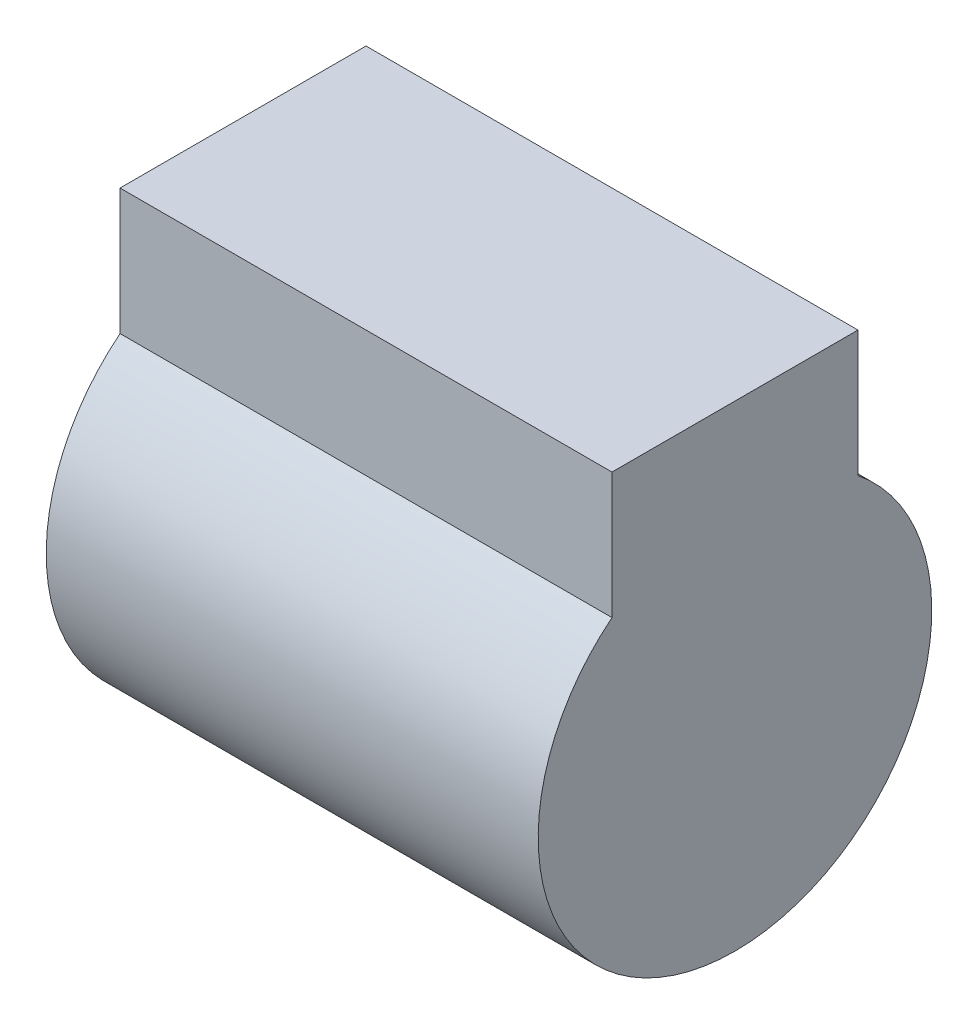
ISO-10303-21;
HEADER;
FILE_DESCRIPTION(('STEP AP214'),'2;1');
FILE_NAME('part.step','',(''),(''),'','','');
FILE_SCHEMA(('AUTOMOTIVE_DESIGN { 1 0 10303 214 1 1 1 1 }'));
ENDSEC;
DATA;
#1=APPLICATION_CONTEXT('core data for automotive mechanical design processes');
#2=APPLICATION_PROTOCOL_DEFINITION('international standard','automotive_design',2000,#1);
#3=PRODUCT_CONTEXT('',#1,'mechanical');
#4=PRODUCT('Part','Part','',(#3));
#5=PRODUCT_RELATED_PRODUCT_CATEGORY('part','',(#4));
#6=PRODUCT_DEFINITION_FORMATION('','',#4);
#7=PRODUCT_DEFINITION_CONTEXT('part definition',#1,'design');
#8=PRODUCT_DEFINITION('design','',#6,#7);
#9=PRODUCT_DEFINITION_SHAPE('','',#8);
#10=(LENGTH_UNIT() NAMED_UNIT(*) SI_UNIT(.MILLI.,.METRE.));
#11=(NAMED_UNIT(*) PLANE_ANGLE_UNIT() SI_UNIT($,.RADIAN.));
#12=(NAMED_UNIT(*) SI_UNIT($,.STERADIAN.) SOLID_ANGLE_UNIT());
#13=UNCERTAINTY_MEASURE_WITH_UNIT(LENGTH_MEASURE(1.E-05),#10,'distance_accuracy_value','');
#14=(GEOMETRIC_REPRESENTATION_CONTEXT(3) GLOBAL_UNCERTAINTY_ASSIGNED_CONTEXT((#13)) GLOBAL_UNIT_ASSIGNED_CONTEXT((#10,
#11,#12)) REPRESENTATION_CONTEXT('',''));
#15=CARTESIAN_POINT('',(0.,0.,0.));
#16=DIRECTION('',(0.,0.,1.));
#17=DIRECTION('',(1.,0.,0.));
#18=AXIS2_PLACEMENT_3D('',#15,#16,#17);
#19=CARTESIAN_POINT('',(40.,0.,0.));
#20=DIRECTION('',(-1.,0.,0.));
#21=DIRECTION('',(0.,0.,1.));
#22=AXIS2_PLACEMENT_3D('',#19,#20,#21);
#23=CYLINDRICAL_SURFACE('',#22,16.);
#24=DIRECTION('',(-1.,0.,0.));
#25=VECTOR('',#24,1.);
#26=CARTESIAN_POINT('',(40.,12.4899959967968,-10.));
#27=LINE('',#26,#25);
#28=CARTESIAN_POINT('',(40.,12.4899959967968,-10.));
#29=VERTEX_POINT('',#28);
#30=CARTESIAN_POINT('',(0.,12.4899959967968,-10.));
#31=VERTEX_POINT('',#30);
#32=EDGE_CURVE('E63',#29,#31,#27,.T.);
#33=ORIENTED_EDGE('',*,*,#32,.F.);
#34=CARTESIAN_POINT('',(40.,0.,0.));
#35=DIRECTION('',(1.,0.,0.));
#36=DIRECTION('',(0.,0.,-1.));
#37=AXIS2_PLACEMENT_3D('',#34,#35,#36);
#38=CIRCLE('',#37,16.);
#39=CARTESIAN_POINT('',(40.,12.4899959967968,10.));
#40=VERTEX_POINT('',#39);
#41=EDGE_CURVE('E11',#40,#29,#38,.T.);
#42=ORIENTED_EDGE('',*,*,#41,.F.);
#43=DIRECTION('',(-1.,0.,0.));
#44=VECTOR('',#43,1.);
#45=CARTESIAN_POINT('',(40.,12.4899959967968,10.));
#46=LINE('',#45,#44);
#47=CARTESIAN_POINT('',(0.,12.4899959967968,10.));
#48=VERTEX_POINT('',#47);
#49=EDGE_CURVE('E90',#40,#48,#46,.T.);
#50=ORIENTED_EDGE('',*,*,#49,.T.);
#51=CARTESIAN_POINT('',(0.,0.,0.));
#52=DIRECTION('',(1.,0.,0.));
#53=DIRECTION('',(0.,0.,-1.));
#54=AXIS2_PLACEMENT_3D('',#51,#52,#53);
#55=CIRCLE('',#54,16.);
#56=EDGE_CURVE('E48',#48,#31,#55,.T.);
#57=ORIENTED_EDGE('',*,*,#56,.T.);
#58=EDGE_LOOP('',(#33,#42,#50,#57));
#59=FACE_BOUND('',#58,.T.);
#60=ADVANCED_FACE('F45',(#59),#23,.T.);
#61=CARTESIAN_POINT('',(40.,0.,0.));
#62=DIRECTION('',(1.,0.,0.));
#63=DIRECTION('',(0.,0.,-1.));
#64=AXIS2_PLACEMENT_3D('',#61,#62,#63);
#65=PLANE('',#64);
#66=ORIENTED_EDGE('',*,*,#41,.T.);
#67=DIRECTION('',(0.,1.,0.));
#68=VECTOR('',#67,1.);
#69=CARTESIAN_POINT('',(40.,12.4899959967968,-10.));
#70=LINE('',#69,#68);
#71=CARTESIAN_POINT('',(40.,22.7394063576082,-10.));
#72=VERTEX_POINT('',#71);
#73=EDGE_CURVE('E99',#29,#72,#70,.T.);
#74=ORIENTED_EDGE('',*,*,#73,.T.);
#75=DIRECTION('',(0.,0.,1.));
#76=VECTOR('',#75,1.);
#77=CARTESIAN_POINT('',(40.,22.7394063576082,-10.));
#78=LINE('',#77,#76);
#79=CARTESIAN_POINT('',(40.,22.7394063576082,10.));
#80=VERTEX_POINT('',#79);
#81=EDGE_CURVE('E93',#72,#80,#78,.T.);
#82=ORIENTED_EDGE('',*,*,#81,.T.);
#83=DIRECTION('',(0.,1.,0.));
#84=VECTOR('',#83,1.);
#85=CARTESIAN_POINT('',(40.,12.4899959967968,10.));
#86=LINE('',#85,#84);
#87=EDGE_CURVE('E83',#40,#80,#86,.T.);
#88=ORIENTED_EDGE('',*,*,#87,.F.);
#89=EDGE_LOOP('',(#66,#74,#82,#88));
#90=FACE_BOUND('',#89,.T.);
#91=ADVANCED_FACE('F97',(#90),#65,.T.);
#92=CARTESIAN_POINT('',(0.,0.,0.));
#93=DIRECTION('',(1.,0.,0.));
#94=DIRECTION('',(0.,0.,-1.));
#95=AXIS2_PLACEMENT_3D('',#92,#93,#94);
#96=PLANE('',#95);
#97=CARTESIAN_POINT('',(0.,0.,0.));
#98=DIRECTION('',(1.,0.,0.));
#99=DIRECTION('',(0.,0.,-1.));
#100=AXIS2_PLACEMENT_3D('',#97,#98,#99);
#101=CIRCLE('',#100,3.75);
#102=CARTESIAN_POINT('',(0.,0.,-3.75));
#103=VERTEX_POINT('',#102);
#104=EDGE_CURVE('E121',#103,#103,#101,.T.);
#105=ORIENTED_EDGE('',*,*,#104,.T.);
#106=EDGE_LOOP('',(#105));
#107=FACE_BOUND('',#106,.T.);
#108=ORIENTED_EDGE('',*,*,#56,.F.);
#109=DIRECTION('',(0.,-1.,0.));
#110=VECTOR('',#109,1.);
#111=CARTESIAN_POINT('',(0.,22.7394063576082,10.));
#112=LINE('',#111,#110);
#113=CARTESIAN_POINT('',(0.,22.7394063576082,10.));
#114=VERTEX_POINT('',#113);
#115=EDGE_CURVE('E134',#114,#48,#112,.T.);
#116=ORIENTED_EDGE('',*,*,#115,.F.);
#117=DIRECTION('',(0.,0.,1.));
#118=VECTOR('',#117,1.);
#119=CARTESIAN_POINT('',(0.,22.7394063576082,-10.));
#120=LINE('',#119,#118);
#121=CARTESIAN_POINT('',(0.,22.7394063576082,-10.));
#122=VERTEX_POINT('',#121);
#123=EDGE_CURVE('E107',#122,#114,#120,.T.);
#124=ORIENTED_EDGE('',*,*,#123,.F.);
#125=DIRECTION('',(0.,1.,0.));
#126=VECTOR('',#125,1.);
#127=CARTESIAN_POINT('',(0.,12.4899959967968,-10.));
#128=LINE('',#127,#126);
#129=EDGE_CURVE('E94',#31,#122,#128,.T.);
#130=ORIENTED_EDGE('',*,*,#129,.F.);
#131=EDGE_LOOP('',(#108,#116,#124,#130));
#132=FACE_BOUND('',#131,.T.);
#133=ADVANCED_FACE('F139',(#107,#132),#96,.F.);
#134=CARTESIAN_POINT('',(8.5,0.,0.));
#135=DIRECTION('',(-1.,0.,0.));
#136=DIRECTION('',(0.,0.,1.));
#137=AXIS2_PLACEMENT_3D('',#134,#135,#136);
#138=CYLINDRICAL_SURFACE('',#137,3.75);
#139=CARTESIAN_POINT('',(8.5,0.,0.));
#140=DIRECTION('',(1.,0.,0.));
#141=DIRECTION('',(0.,0.,-1.));
#142=AXIS2_PLACEMENT_3D('',#139,#140,#141);
#143=CIRCLE('',#142,3.75);
#144=CARTESIAN_POINT('',(8.5,0.,-3.75));
#145=VERTEX_POINT('',#144);
#146=EDGE_CURVE('E117',#145,#145,#143,.T.);
#147=ORIENTED_EDGE('',*,*,#146,.T.);
#148=EDGE_LOOP('',(#147));
#149=FACE_BOUND('',#148,.T.);
#150=ORIENTED_EDGE('',*,*,#104,.F.);
#151=EDGE_LOOP('',(#150));
#152=FACE_BOUND('',#151,.T.);
#153=ADVANCED_FACE('F150',(#149,#152),#138,.F.);
#154=CARTESIAN_POINT('',(8.5,0.,0.));
#155=DIRECTION('',(1.,0.,0.));
#156=DIRECTION('',(0.,0.,-1.));
#157=AXIS2_PLACEMENT_3D('',#154,#155,#156);
#158=PLANE('',#157);
#159=ORIENTED_EDGE('',*,*,#146,.F.);
#160=EDGE_LOOP('',(#159));
#161=FACE_BOUND('',#160,.T.);
#162=ADVANCED_FACE('F154',(#161),#158,.F.);
#163=CARTESIAN_POINT('',(40.,12.4899959967968,-10.));
#164=DIRECTION('',(0.,0.,1.));
#165=DIRECTION('',(1.,0.,0.));
#166=AXIS2_PLACEMENT_3D('',#163,#164,#165);
#167=PLANE('',#166);
#168=ORIENTED_EDGE('',*,*,#129,.T.);
#169=DIRECTION('',(-1.,0.,0.));
#170=VECTOR('',#169,1.);
#171=CARTESIAN_POINT('',(40.,22.7394063576082,-10.));
#172=LINE('',#171,#170);
#173=EDGE_CURVE('E109',#72,#122,#172,.T.);
#174=ORIENTED_EDGE('',*,*,#173,.F.);
#175=ORIENTED_EDGE('',*,*,#73,.F.);
#176=ORIENTED_EDGE('',*,*,#32,.T.);
#177=EDGE_LOOP('',(#168,#174,#175,#176));
#178=FACE_BOUND('',#177,.T.);
#179=ADVANCED_FACE('F157',(#178),#167,.F.);
#180=CARTESIAN_POINT('',(40.,22.7394063576082,-10.));
#181=DIRECTION('',(0.,-1.,0.));
#182=DIRECTION('',(0.,0.,-1.));
#183=AXIS2_PLACEMENT_3D('',#180,#181,#182);
#184=PLANE('',#183);
#185=ORIENTED_EDGE('',*,*,#123,.T.);
#186=DIRECTION('',(-1.,0.,0.));
#187=VECTOR('',#186,1.);
#188=CARTESIAN_POINT('',(40.,22.7394063576082,10.));
#189=LINE('',#188,#187);
#190=EDGE_CURVE('E88',#80,#114,#189,.T.);
#191=ORIENTED_EDGE('',*,*,#190,.F.);
#192=ORIENTED_EDGE('',*,*,#81,.F.);
#193=ORIENTED_EDGE('',*,*,#173,.T.);
#194=EDGE_LOOP('',(#185,#191,#192,#193));
#195=FACE_BOUND('',#194,.T.);
#196=ADVANCED_FACE('F105',(#195),#184,.F.);
#197=CARTESIAN_POINT('',(40.,22.7394063576082,10.));
#198=DIRECTION('',(0.,0.,-1.));
#199=DIRECTION('',(-1.,0.,0.));
#200=AXIS2_PLACEMENT_3D('',#197,#198,#199);
#201=PLANE('',#200);
#202=ORIENTED_EDGE('',*,*,#115,.T.);
#203=ORIENTED_EDGE('',*,*,#49,.F.);
#204=ORIENTED_EDGE('',*,*,#87,.T.);
#205=ORIENTED_EDGE('',*,*,#190,.T.);
#206=EDGE_LOOP('',(#202,#203,#204,#205));
#207=FACE_BOUND('',#206,.T.);
#208=ADVANCED_FACE('F86',(#207),#201,.F.);
#209=CLOSED_SHELL('',(#60,#91,#133,#153,#162,#179,#196,#208));
#210=MANIFOLD_SOLID_BREP('B2',#209);
#211=ADVANCED_BREP_SHAPE_REPRESENTATION('',(#18,#210),#14);
#212=SHAPE_DEFINITION_REPRESENTATION(#9,#211);
ENDSEC;
END-ISO-10303-21;
